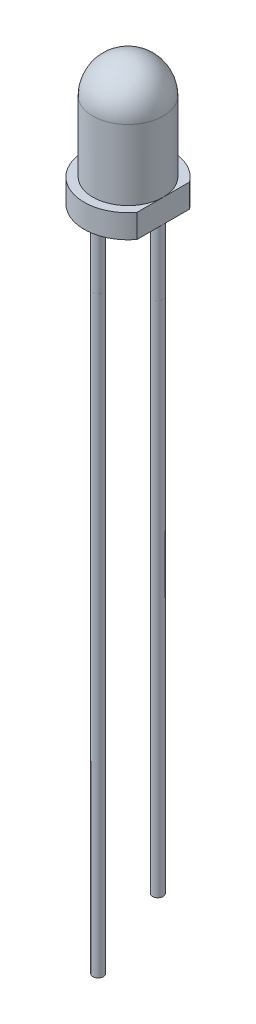
ISO-10303-21;
HEADER;
FILE_DESCRIPTION(('STEP AP214'),'2;1');
FILE_NAME('part.step','',(''),(''),'','','');
FILE_SCHEMA(('AUTOMOTIVE_DESIGN { 1 0 10303 214 1 1 1 1 }'));
ENDSEC;
DATA;
#1=APPLICATION_CONTEXT('core data for automotive mechanical design processes');
#2=APPLICATION_PROTOCOL_DEFINITION('international standard','automotive_design',2000,#1);
#3=PRODUCT_CONTEXT('',#1,'mechanical');
#4=PRODUCT('Part','Part','',(#3));
#5=PRODUCT_RELATED_PRODUCT_CATEGORY('part','',(#4));
#6=PRODUCT_DEFINITION_FORMATION('','',#4);
#7=PRODUCT_DEFINITION_CONTEXT('part definition',#1,'design');
#8=PRODUCT_DEFINITION('design','',#6,#7);
#9=PRODUCT_DEFINITION_SHAPE('','',#8);
#10=(LENGTH_UNIT() NAMED_UNIT(*) SI_UNIT(.MILLI.,.METRE.));
#11=(NAMED_UNIT(*) PLANE_ANGLE_UNIT() SI_UNIT($,.RADIAN.));
#12=(NAMED_UNIT(*) SI_UNIT($,.STERADIAN.) SOLID_ANGLE_UNIT());
#13=UNCERTAINTY_MEASURE_WITH_UNIT(LENGTH_MEASURE(1.E-05),#10,'distance_accuracy_value','');
#14=(GEOMETRIC_REPRESENTATION_CONTEXT(3) GLOBAL_UNCERTAINTY_ASSIGNED_CONTEXT((#13)) GLOBAL_UNIT_ASSIGNED_CONTEXT((#10,
#11,#12)) REPRESENTATION_CONTEXT('',''));
#15=CARTESIAN_POINT('',(0.,0.,0.));
#16=DIRECTION('',(0.,0.,1.));
#17=DIRECTION('',(1.,0.,0.));
#18=AXIS2_PLACEMENT_3D('',#15,#16,#17);
#19=CARTESIAN_POINT('',(0.,1.,0.));
#20=DIRECTION('',(0.,-1.,0.));
#21=DIRECTION('',(0.,0.,-1.));
#22=AXIS2_PLACEMENT_3D('',#19,#20,#21);
#23=CYLINDRICAL_SURFACE('',#22,1.87);
#24=CARTESIAN_POINT('',(0.,0.,0.));
#25=DIRECTION('',(0.,-1.,0.));
#26=DIRECTION('',(0.,0.,-1.));
#27=AXIS2_PLACEMENT_3D('',#24,#25,#26);
#28=CIRCLE('',#27,1.87);
#29=CARTESIAN_POINT('',(1.5,0.,1.11664676599182));
#30=VERTEX_POINT('',#29);
#31=CARTESIAN_POINT('',(1.5,0.,-1.11664676599182));
#32=VERTEX_POINT('',#31);
#33=EDGE_CURVE('P0_E93',#30,#32,#28,.T.);
#34=ORIENTED_EDGE('',*,*,#33,.F.);
#35=DIRECTION('',(0.,-1.,0.));
#36=VECTOR('',#35,1.);
#37=CARTESIAN_POINT('',(1.5,1.,1.11664676599182));
#38=LINE('',#37,#36);
#39=CARTESIAN_POINT('',(1.5,1.,1.11664676599182));
#40=VERTEX_POINT('',#39);
#41=EDGE_CURVE('P0_E11',#40,#30,#38,.T.);
#42=ORIENTED_EDGE('',*,*,#41,.F.);
#43=CARTESIAN_POINT('',(0.,1.,0.));
#44=DIRECTION('',(0.,-1.,0.));
#45=DIRECTION('',(0.,0.,-1.));
#46=AXIS2_PLACEMENT_3D('',#43,#44,#45);
#47=CIRCLE('',#46,1.87);
#48=CARTESIAN_POINT('',(1.5,1.,-1.11664676599182));
#49=VERTEX_POINT('',#48);
#50=EDGE_CURVE('P0_E99',#40,#49,#47,.T.);
#51=ORIENTED_EDGE('',*,*,#50,.T.);
#52=DIRECTION('',(0.,-1.,0.));
#53=VECTOR('',#52,1.);
#54=CARTESIAN_POINT('',(1.5,1.,-1.11664676599182));
#55=LINE('',#54,#53);
#56=EDGE_CURVE('P0_E43',#49,#32,#55,.T.);
#57=ORIENTED_EDGE('',*,*,#56,.T.);
#58=EDGE_LOOP('',(#34,#42,#51,#57));
#59=FACE_BOUND('',#58,.T.);
#60=ADVANCED_FACE('P0_F40',(#59),#23,.T.);
#61=CARTESIAN_POINT('',(1.5,1.,-1.11664676599182));
#62=DIRECTION('',(1.,0.,0.));
#63=DIRECTION('',(0.,0.,-1.));
#64=AXIS2_PLACEMENT_3D('',#61,#62,#63);
#65=PLANE('',#64);
#66=DIRECTION('',(0.,0.,1.));
#67=VECTOR('',#66,1.);
#68=CARTESIAN_POINT('',(1.5,0.,-1.11664676599182));
#69=LINE('',#68,#67);
#70=EDGE_CURVE('P0_E120',#32,#30,#69,.T.);
#71=ORIENTED_EDGE('',*,*,#70,.F.);
#72=ORIENTED_EDGE('',*,*,#56,.F.);
#73=DIRECTION('',(0.,0.,1.));
#74=VECTOR('',#73,1.);
#75=CARTESIAN_POINT('',(1.5,1.,-1.11664676599182));
#76=LINE('',#75,#74);
#77=CARTESIAN_POINT('',(1.5,1.,0.));
#78=VERTEX_POINT('',#77);
#79=EDGE_CURVE('P0_E69',#49,#78,#76,.T.);
#80=ORIENTED_EDGE('',*,*,#79,.T.);
#81=EDGE_CURVE('P0_E55',#78,#40,#76,.T.);
#82=ORIENTED_EDGE('',*,*,#81,.T.);
#83=ORIENTED_EDGE('',*,*,#41,.T.);
#84=EDGE_LOOP('',(#71,#72,#80,#82,#83));
#85=FACE_BOUND('',#84,.T.);
#86=ADVANCED_FACE('P0_F110',(#85),#65,.T.);
#87=CARTESIAN_POINT('',(0.,1.,0.));
#88=DIRECTION('',(0.,-1.,0.));
#89=DIRECTION('',(0.,0.,-1.));
#90=AXIS2_PLACEMENT_3D('',#87,#88,#89);
#91=PLANE('',#90);
#92=ORIENTED_EDGE('',*,*,#81,.F.);
#93=CARTESIAN_POINT('',(0.,1.,0.));
#94=DIRECTION('',(0.,1.,0.));
#95=DIRECTION('',(0.,0.,1.));
#96=AXIS2_PLACEMENT_3D('',#93,#94,#95);
#97=CIRCLE('',#96,1.5);
#98=EDGE_CURVE('P0_E88',#78,#78,#97,.T.);
#99=ORIENTED_EDGE('',*,*,#98,.F.);
#100=ORIENTED_EDGE('',*,*,#79,.F.);
#101=ORIENTED_EDGE('',*,*,#50,.F.);
#102=EDGE_LOOP('',(#92,#99,#100,#101));
#103=FACE_BOUND('',#102,.T.);
#104=ADVANCED_FACE('P0_F107',(#103),#91,.F.);
#105=CARTESIAN_POINT('',(0.,0.,0.));
#106=DIRECTION('',(0.,-1.,0.));
#107=DIRECTION('',(0.,0.,-1.));
#108=AXIS2_PLACEMENT_3D('',#105,#106,#107);
#109=PLANE('',#108);
#110=CARTESIAN_POINT('',(1.27,0.,0.));
#111=DIRECTION('',(0.,-1.,0.));
#112=DIRECTION('',(0.,0.,-1.));
#113=AXIS2_PLACEMENT_3D('',#110,#111,#112);
#114=CIRCLE('',#113,0.225);
#115=CARTESIAN_POINT('',(1.27,0.,-0.225));
#116=VERTEX_POINT('',#115);
#117=EDGE_CURVE('P0_E154',#116,#116,#114,.T.);
#118=ORIENTED_EDGE('',*,*,#117,.F.);
#119=EDGE_LOOP('',(#118));
#120=FACE_BOUND('',#119,.T.);
#121=CARTESIAN_POINT('',(-1.27,0.,0.));
#122=DIRECTION('',(0.,-1.,0.));
#123=DIRECTION('',(0.,0.,-1.));
#124=AXIS2_PLACEMENT_3D('',#121,#122,#123);
#125=CIRCLE('',#124,0.225);
#126=CARTESIAN_POINT('',(-1.27,0.,-0.225));
#127=VERTEX_POINT('',#126);
#128=EDGE_CURVE('P0_E153',#127,#127,#125,.T.);
#129=ORIENTED_EDGE('',*,*,#128,.F.);
#130=EDGE_LOOP('',(#129));
#131=FACE_BOUND('',#130,.T.);
#132=ORIENTED_EDGE('',*,*,#33,.T.);
#133=ORIENTED_EDGE('',*,*,#70,.T.);
#134=EDGE_LOOP('',(#132,#133));
#135=FACE_BOUND('',#134,.T.);
#136=ADVANCED_FACE('P0_F105',(#120,#131,#135),#109,.T.);
#137=CARTESIAN_POINT('',(0.,3.99,0.));
#138=DIRECTION('',(-1.,0.,0.));
#139=DIRECTION('',(0.,1.,0.));
#140=AXIS2_PLACEMENT_3D('',#137,#138,#139);
#141=SPHERICAL_SURFACE('',#140,1.5);
#142=CARTESIAN_POINT('',(0.,3.99,0.));
#143=DIRECTION('',(0.,-1.,0.));
#144=DIRECTION('',(0.,0.,-1.));
#145=AXIS2_PLACEMENT_3D('',#142,#143,#144);
#146=CIRCLE('',#145,1.5);
#147=CARTESIAN_POINT('',(-1.5,3.99,0.));
#148=VERTEX_POINT('',#147);
#149=CARTESIAN_POINT('',(1.5,3.99,0.));
#150=VERTEX_POINT('',#149);
#151=EDGE_CURVE('P0_E77',#148,#150,#146,.T.);
#152=ORIENTED_EDGE('',*,*,#151,.F.);
#153=CARTESIAN_POINT('',(0.,3.99,0.));
#154=DIRECTION('',(0.,-1.,0.));
#155=DIRECTION('',(0.,0.,-1.));
#156=AXIS2_PLACEMENT_3D('',#153,#154,#155);
#157=CIRCLE('',#156,1.5);
#158=EDGE_CURVE('P0_E80',#150,#148,#157,.T.);
#159=ORIENTED_EDGE('',*,*,#158,.F.);
#160=EDGE_LOOP('',(#152,#159));
#161=FACE_BOUND('',#160,.T.);
#162=ADVANCED_FACE('P0_F79',(#161),#141,.T.);
#163=CARTESIAN_POINT('',(0.,5.491,0.));
#164=DIRECTION('',(0.,-1.,0.));
#165=DIRECTION('',(0.,0.,-1.));
#166=AXIS2_PLACEMENT_3D('',#163,#164,#165);
#167=CYLINDRICAL_SURFACE('',#166,1.5);
#168=ORIENTED_EDGE('',*,*,#151,.T.);
#169=ORIENTED_EDGE('',*,*,#158,.T.);
#170=EDGE_LOOP('',(#168,#169));
#171=FACE_BOUND('',#170,.T.);
#172=ORIENTED_EDGE('',*,*,#98,.T.);
#173=EDGE_LOOP('',(#172));
#174=FACE_BOUND('',#173,.T.);
#175=ADVANCED_FACE('P0_F85',(#171,#174),#167,.T.);
#176=CARTESIAN_POINT('',(-1.27,-29.,0.));
#177=DIRECTION('',(0.,1.,0.));
#178=DIRECTION('',(0.,0.,1.));
#179=AXIS2_PLACEMENT_3D('',#176,#177,#178);
#180=CYLINDRICAL_SURFACE('',#179,0.225);
#181=CARTESIAN_POINT('',(-1.27,-29.,0.));
#182=DIRECTION('',(0.,-1.,0.));
#183=DIRECTION('',(0.,0.,-1.));
#184=AXIS2_PLACEMENT_3D('',#181,#182,#183);
#185=CIRCLE('',#184,0.225);
#186=CARTESIAN_POINT('',(-1.27,-29.,-0.225));
#187=VERTEX_POINT('',#186);
#188=EDGE_CURVE('P0_E83',#187,#187,#185,.T.);
#189=ORIENTED_EDGE('',*,*,#188,.F.);
#190=EDGE_LOOP('',(#189));
#191=FACE_BOUND('',#190,.T.);
#192=ORIENTED_EDGE('',*,*,#128,.T.);
#193=EDGE_LOOP('',(#192));
#194=FACE_BOUND('',#193,.T.);
#195=ADVANCED_FACE('P0_F127',(#191,#194),#180,.T.);
#196=CARTESIAN_POINT('',(-1.27,-29.,0.));
#197=DIRECTION('',(0.,-1.,0.));
#198=DIRECTION('',(0.,0.,-1.));
#199=AXIS2_PLACEMENT_3D('',#196,#197,#198);
#200=PLANE('',#199);
#201=ORIENTED_EDGE('',*,*,#188,.T.);
#202=EDGE_LOOP('',(#201));
#203=FACE_BOUND('',#202,.T.);
#204=ADVANCED_FACE('P0_F131',(#203),#200,.T.);
#205=CARTESIAN_POINT('',(1.27,-24.775,0.));
#206=DIRECTION('',(0.,1.,0.));
#207=DIRECTION('',(0.,0.,1.));
#208=AXIS2_PLACEMENT_3D('',#205,#206,#207);
#209=CYLINDRICAL_SURFACE('',#208,0.225);
#210=CARTESIAN_POINT('',(1.27,-24.775,0.));
#211=DIRECTION('',(0.,-1.,0.));
#212=DIRECTION('',(0.,0.,-1.));
#213=AXIS2_PLACEMENT_3D('',#210,#211,#212);
#214=CIRCLE('',#213,0.225);
#215=CARTESIAN_POINT('',(1.27,-24.775,-0.225));
#216=VERTEX_POINT('',#215);
#217=EDGE_CURVE('P0_E152',#216,#216,#214,.T.);
#218=ORIENTED_EDGE('',*,*,#217,.F.);
#219=EDGE_LOOP('',(#218));
#220=FACE_BOUND('',#219,.T.);
#221=ORIENTED_EDGE('',*,*,#117,.T.);
#222=EDGE_LOOP('',(#221));
#223=FACE_BOUND('',#222,.T.);
#224=ADVANCED_FACE('P0_F136',(#220,#223),#209,.T.);
#225=CARTESIAN_POINT('',(1.27,-24.775,0.));
#226=DIRECTION('',(0.,-1.,0.));
#227=DIRECTION('',(0.,0.,-1.));
#228=AXIS2_PLACEMENT_3D('',#225,#226,#227);
#229=PLANE('',#228);
#230=ORIENTED_EDGE('',*,*,#217,.T.);
#231=EDGE_LOOP('',(#230));
#232=FACE_BOUND('',#231,.T.);
#233=ADVANCED_FACE('P0_F144',(#232),#229,.T.);
#234=CLOSED_SHELL('',(#60,#86,#104,#136,#162,#175,#195,#204,#224,#233));
#235=MANIFOLD_SOLID_BREP('P0_B2',#234);
#236=CARTESIAN_POINT('',(1.27,-2.775,0.));
#237=DIRECTION('',(0.,0.,-1.));
#238=DIRECTION('',(0.,1.,0.));
#239=AXIS2_PLACEMENT_3D('',#236,#237,#238);
#240=SPHERICAL_SURFACE('',#239,0.225);
#241=CARTESIAN_POINT('',(1.27,-2.775,0.));
#242=DIRECTION('',(0.,1.,0.));
#243=DIRECTION('',(0.,0.,1.));
#244=AXIS2_PLACEMENT_3D('',#241,#242,#243);
#245=CIRCLE('',#244,0.225);
#246=CARTESIAN_POINT('',(1.27,-2.775,0.225));
#247=VERTEX_POINT('',#246);
#248=CARTESIAN_POINT('',(1.27,-2.775,-0.225));
#249=VERTEX_POINT('',#248);
#250=EDGE_CURVE('P1_E22',#247,#249,#245,.T.);
#251=ORIENTED_EDGE('',*,*,#250,.F.);
#252=CARTESIAN_POINT('',(1.27,-2.775,0.));
#253=DIRECTION('',(0.,1.,0.));
#254=DIRECTION('',(0.,0.,1.));
#255=AXIS2_PLACEMENT_3D('',#252,#253,#254);
#256=CIRCLE('',#255,0.225);
#257=EDGE_CURVE('P1_E11',#249,#247,#256,.T.);
#258=ORIENTED_EDGE('',*,*,#257,.F.);
#259=EDGE_LOOP('',(#251,#258));
#260=FACE_BOUND('',#259,.T.);
#261=ADVANCED_FACE('P1_F16',(#260),#240,.T.);
#262=OPEN_SHELL('',(#261));
#263=SHELL_BASED_SURFACE_MODEL('P1_B1',(#262));
#264=CARTESIAN_POINT('',(-1.27,-3.775,0.));
#265=DIRECTION('',(0.,0.,-1.));
#266=DIRECTION('',(0.,1.,0.));
#267=AXIS2_PLACEMENT_3D('',#264,#265,#266);
#268=SPHERICAL_SURFACE('',#267,0.225);
#269=CARTESIAN_POINT('',(-1.27,-3.775,0.));
#270=DIRECTION('',(0.,1.,0.));
#271=DIRECTION('',(0.,0.,1.));
#272=AXIS2_PLACEMENT_3D('',#269,#270,#271);
#273=CIRCLE('',#272,0.225);
#274=CARTESIAN_POINT('',(-1.27,-3.775,0.225));
#275=VERTEX_POINT('',#274);
#276=CARTESIAN_POINT('',(-1.27,-3.775,-0.225));
#277=VERTEX_POINT('',#276);
#278=EDGE_CURVE('P2_E22',#275,#277,#273,.T.);
#279=ORIENTED_EDGE('',*,*,#278,.F.);
#280=CARTESIAN_POINT('',(-1.27,-3.775,0.));
#281=DIRECTION('',(0.,1.,0.));
#282=DIRECTION('',(0.,0.,1.));
#283=AXIS2_PLACEMENT_3D('',#280,#281,#282);
#284=CIRCLE('',#283,0.225);
#285=EDGE_CURVE('P2_E11',#277,#275,#284,.T.);
#286=ORIENTED_EDGE('',*,*,#285,.F.);
#287=EDGE_LOOP('',(#279,#286));
#288=FACE_BOUND('',#287,.T.);
#289=ADVANCED_FACE('P2_F16',(#288),#268,.T.);
#290=OPEN_SHELL('',(#289));
#291=SHELL_BASED_SURFACE_MODEL('P2_B1',(#290));
#292=CARTESIAN_POINT('',(0.,3.99,0.));
#293=DIRECTION('',(-1.,0.,0.));
#294=DIRECTION('',(0.,1.,0.));
#295=AXIS2_PLACEMENT_3D('',#292,#293,#294);
#296=SPHERICAL_SURFACE('',#295,1.5);
#297=CARTESIAN_POINT('',(0.,3.99,0.));
#298=DIRECTION('',(0.,-1.,0.));
#299=DIRECTION('',(0.,0.,-1.));
#300=AXIS2_PLACEMENT_3D('',#297,#298,#299);
#301=CIRCLE('',#300,1.5);
#302=CARTESIAN_POINT('',(-1.5,3.99,0.));
#303=VERTEX_POINT('',#302);
#304=CARTESIAN_POINT('',(1.5,3.99,0.));
#305=VERTEX_POINT('',#304);
#306=EDGE_CURVE('P3_E22',#303,#305,#301,.T.);
#307=ORIENTED_EDGE('',*,*,#306,.F.);
#308=CARTESIAN_POINT('',(0.,3.99,0.));
#309=DIRECTION('',(0.,-1.,0.));
#310=DIRECTION('',(0.,0.,-1.));
#311=AXIS2_PLACEMENT_3D('',#308,#309,#310);
#312=CIRCLE('',#311,1.5);
#313=EDGE_CURVE('P3_E11',#305,#303,#312,.T.);
#314=ORIENTED_EDGE('',*,*,#313,.F.);
#315=EDGE_LOOP('',(#307,#314));
#316=FACE_BOUND('',#315,.T.);
#317=ADVANCED_FACE('P3_F16',(#316),#296,.T.);
#318=OPEN_SHELL('',(#317));
#319=SHELL_BASED_SURFACE_MODEL('P3_B1',(#318));
#320=ADVANCED_BREP_SHAPE_REPRESENTATION('',(#18,#235),#14);
#321=MANIFOLD_SURFACE_SHAPE_REPRESENTATION('',(#18,#263,#291,#319),#14);
#322=SHAPE_REPRESENTATION('',(#18),#14);
#323=SHAPE_DEFINITION_REPRESENTATION(#9,#322);
#324=SHAPE_REPRESENTATION_RELATIONSHIP('','',#322,#320);
#325=SHAPE_REPRESENTATION_RELATIONSHIP('','',#322,#321);
ENDSEC;
END-ISO-10303-21;
